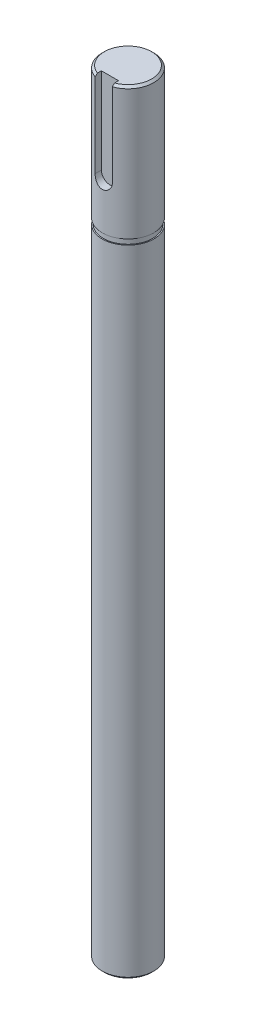
ISO-10303-21;
HEADER;
FILE_DESCRIPTION(('STEP AP214'),'2;1');
FILE_NAME('part.step','',(''),(''),'','','');
FILE_SCHEMA(('AUTOMOTIVE_DESIGN { 1 0 10303 214 1 1 1 1 }'));
ENDSEC;
DATA;
#1=APPLICATION_CONTEXT('core data for automotive mechanical design processes');
#2=APPLICATION_PROTOCOL_DEFINITION('international standard','automotive_design',2000,#1);
#3=PRODUCT_CONTEXT('',#1,'mechanical');
#4=PRODUCT('Part','Part','',(#3));
#5=PRODUCT_RELATED_PRODUCT_CATEGORY('part','',(#4));
#6=PRODUCT_DEFINITION_FORMATION('','',#4);
#7=PRODUCT_DEFINITION_CONTEXT('part definition',#1,'design');
#8=PRODUCT_DEFINITION('design','',#6,#7);
#9=PRODUCT_DEFINITION_SHAPE('','',#8);
#10=(LENGTH_UNIT() NAMED_UNIT(*) SI_UNIT(.MILLI.,.METRE.));
#11=(NAMED_UNIT(*) PLANE_ANGLE_UNIT() SI_UNIT($,.RADIAN.));
#12=(NAMED_UNIT(*) SI_UNIT($,.STERADIAN.) SOLID_ANGLE_UNIT());
#13=UNCERTAINTY_MEASURE_WITH_UNIT(LENGTH_MEASURE(1.E-05),#10,'distance_accuracy_value','');
#14=(GEOMETRIC_REPRESENTATION_CONTEXT(3) GLOBAL_UNCERTAINTY_ASSIGNED_CONTEXT((#13)) GLOBAL_UNIT_ASSIGNED_CONTEXT((#10,
#11,#12)) REPRESENTATION_CONTEXT('',''));
#15=CARTESIAN_POINT('',(0.,0.,0.));
#16=DIRECTION('',(0.,0.,1.));
#17=DIRECTION('',(1.,0.,0.));
#18=AXIS2_PLACEMENT_3D('',#15,#16,#17);
#19=CARTESIAN_POINT('',(0.,180.,0.));
#20=DIRECTION('',(0.,-1.,0.));
#21=DIRECTION('',(0.,0.,-1.));
#22=AXIS2_PLACEMENT_3D('',#19,#20,#21);
#23=CYLINDRICAL_SURFACE('',#22,6.00000000000001);
#24=CARTESIAN_POINT('',(0.,149.25,0.));
#25=DIRECTION('',(0.,-1.,0.));
#26=DIRECTION('',(0.,0.,-1.));
#27=AXIS2_PLACEMENT_3D('',#24,#25,#26);
#28=CIRCLE('',#27,6.00000000000002);
#29=CARTESIAN_POINT('',(0.,149.25,-6.00000000000002));
#30=VERTEX_POINT('',#29);
#31=EDGE_CURVE('E121',#30,#30,#28,.T.);
#32=ORIENTED_EDGE('',*,*,#31,.F.);
#33=EDGE_LOOP('',(#32));
#34=FACE_BOUND('',#33,.T.);
#35=DIRECTION('',(0.,-1.,0.));
#36=VECTOR('',#35,1.);
#37=CARTESIAN_POINT('',(2.,180.,5.65685424949239));
#38=LINE('',#37,#36);
#39=CARTESIAN_POINT('',(2.,179.5,5.65685424949239));
#40=VERTEX_POINT('',#39);
#41=CARTESIAN_POINT('',(2.,160.,5.65685424949239));
#42=VERTEX_POINT('',#41);
#43=EDGE_CURVE('E50',#40,#42,#38,.T.);
#44=ORIENTED_EDGE('',*,*,#43,.T.);
#45=CARTESIAN_POINT('',(2.,160.,5.65685424949239));
#46=CARTESIAN_POINT('',(2.0000014949184,159.945419006398,5.65684884188679));
#47=CARTESIAN_POINT('',(1.99776424917479,159.890865875621,5.65764519886491));
#48=CARTESIAN_POINT('',(1.9888512140728,159.78218283189,5.66078654578443));
#49=CARTESIAN_POINT('',(1.98217662286705,159.728052808681,5.66313111768245));
#50=CARTESIAN_POINT('',(1.95562135046157,159.56721571361,5.67238184449303));
#51=CARTESIAN_POINT('',(1.92920846605622,159.461638307459,5.68150584999031));
#52=CARTESIAN_POINT('',(1.85991682366084,159.256749615112,5.70456149397719));
#53=CARTESIAN_POINT('',(1.81704715197505,159.157434906254,5.7184904790586));
#54=CARTESIAN_POINT('',(1.71614645792972,158.967320331989,5.74957574438923));
#55=CARTESIAN_POINT('',(1.65810612564544,158.876525741865,5.76673400456218));
#56=CARTESIAN_POINT('',(1.526102787046,158.702559537351,5.80308960804097));
#57=CARTESIAN_POINT('',(1.45164996064405,158.619770239075,5.82233755536619));
#58=CARTESIAN_POINT('',(1.28997688598295,158.467587964417,5.86027697385957));
#59=CARTESIAN_POINT('',(1.20275436910905,158.398197373488,5.87896834543707));
#60=CARTESIAN_POINT('',(1.0152072919125,158.273040962392,5.91427765988456));
#61=CARTESIAN_POINT('',(0.914600178716958,158.217678031196,5.93082875123709));
#62=CARTESIAN_POINT('',(0.704858499931678,158.124815496626,5.95939217209318));
#63=CARTESIAN_POINT('',(0.5957265511868,158.087310436359,5.97140588786621));
#64=CARTESIAN_POINT('',(0.376058690956033,158.032528547817,5.98918142285846));
#65=CARTESIAN_POINT('',(0.265703668920183,158.014593454893,5.99514617977148));
#66=CARTESIAN_POINT('',(0.0433979389113074,157.997367402949,6.00087216807635));
#67=CARTESIAN_POINT('',(-0.0685523824908215,157.998072001461,6.00063487762606));
#68=CARTESIAN_POINT('',(-0.286207690558823,158.017688566213,5.99412077270533));
#69=CARTESIAN_POINT('',(-0.391985405251116,158.035885275919,5.98808121982528));
#70=CARTESIAN_POINT('',(-0.598888128753354,158.088786397348,5.97093921001648));
#71=CARTESIAN_POINT('',(-0.700012879232965,158.123491724413,5.95983647235463));
#72=CARTESIAN_POINT('',(-0.896305246061959,158.208842739201,5.93351336542609));
#73=CARTESIAN_POINT('',(-0.991377011308021,158.259692090245,5.91824075676626));
#74=CARTESIAN_POINT('',(-1.17184917819501,158.375719902781,5.88516775360088));
#75=CARTESIAN_POINT('',(-1.2572469394294,158.440902262093,5.86736667195187));
#76=CARTESIAN_POINT('',(-1.42019467942245,158.587342099994,5.83012543885479));
#77=CARTESIAN_POINT('',(-1.49718722322543,158.669211087219,5.81064757359828));
#78=CARTESIAN_POINT('',(-1.6365440496408,158.844882979432,5.77294980945703));
#79=CARTESIAN_POINT('',(-1.69890360636765,158.938689724807,5.75473031831507));
#80=CARTESIAN_POINT('',(-1.80800665118559,159.137360356707,5.72140062752635));
#81=CARTESIAN_POINT('',(-1.85450601901539,159.242367029866,5.70634029896469));
#82=CARTESIAN_POINT('',(-1.92892046140225,159.45929395518,5.68162194124079));
#83=CARTESIAN_POINT('',(-1.95686487211072,159.571202986744,5.67195538817986));
#84=CARTESIAN_POINT('',(-1.98331631256166,159.736837273496,5.66273084189441));
#85=CARTESIAN_POINT('',(-1.98957012251023,159.789282779708,5.66053335389205));
#86=CARTESIAN_POINT('',(-1.99790923214239,159.8944761568,5.65759407142799));
#87=CARTESIAN_POINT('',(-1.99999991078995,159.947223549089,5.65685039859057));
#88=CARTESIAN_POINT('',(-2.,160.,5.65685424949239));
#89=B_SPLINE_CURVE_WITH_KNOTS('',3,(#45,#46,#47,#48,#49,#50,#51,#52,#53,#54,#55,#56,#57,#58,#59,
#60,#61,#62,#63,#64,#65,#66,#67,#68,#69,#70,#71,#72,#73,#74,#75,#76,#77,#78,#79,#80,#81,#82,#83,
#84,#85,#86,#87,#88),.UNSPECIFIED.,.F.,.F.,(4,2,2,2,2,2,2,2,2,2,2,2,2,2,2,2,2,2,2,2,2,4),(0.,
0.163636969470853,0.32722977233892,0.653162396790758,0.9789153219325,1.30486862627064,
1.64233009925355,1.97985159727496,2.32618265866204,2.67240782242257,3.00658941454808,
3.34069136061286,3.66168836931473,3.98270317816497,4.30794037651937,4.63326613177539,
4.97388108116104,5.31460588498488,5.66036059856086,6.00556734973681,6.16399790665496,
6.32222363058107),.UNSPECIFIED.);
#90=CARTESIAN_POINT('',(-2.,160.,5.65685424949239));
#91=VERTEX_POINT('',#90);
#92=EDGE_CURVE('E43',#42,#91,#89,.T.);
#93=ORIENTED_EDGE('',*,*,#92,.T.);
#94=DIRECTION('',(0.,-1.,0.));
#95=VECTOR('',#94,1.);
#96=CARTESIAN_POINT('',(-2.,180.,5.65685424949239));
#97=LINE('',#96,#95);
#98=CARTESIAN_POINT('',(-2.,179.5,5.65685424949239));
#99=VERTEX_POINT('',#98);
#100=EDGE_CURVE('E110',#99,#91,#97,.T.);
#101=ORIENTED_EDGE('',*,*,#100,.F.);
#102=CARTESIAN_POINT('',(0.,179.5,0.));
#103=DIRECTION('',(0.,-1.,0.));
#104=DIRECTION('',(0.,0.,-1.));
#105=AXIS2_PLACEMENT_3D('',#102,#103,#104);
#106=CIRCLE('',#105,6.00000000000001);
#107=EDGE_CURVE('E124',#99,#40,#106,.T.);
#108=ORIENTED_EDGE('',*,*,#107,.T.);
#109=EDGE_LOOP('',(#44,#93,#101,#108));
#110=FACE_BOUND('',#109,.T.);
#111=ADVANCED_FACE('F35',(#34,#110),#23,.T.);
#112=CARTESIAN_POINT('',(0.,179.5,0.));
#113=DIRECTION('',(0.,-1.,0.));
#114=DIRECTION('',(0.,0.,-1.));
#115=AXIS2_PLACEMENT_3D('',#112,#113,#114);
#116=CONICAL_SURFACE('',#115,6.00000000000001,0.78539816339744);
#117=ORIENTED_EDGE('',*,*,#107,.F.);
#118=CARTESIAN_POINT('',(-2.,177.31534168966,7.93653776258945));
#119=CARTESIAN_POINT('',(-2.,177.522505827229,7.72287670549437));
#120=CARTESIAN_POINT('',(-2.,177.729432380004,7.50898412427123));
#121=CARTESIAN_POINT('',(-2.,178.142622212972,7.08055775473074));
#122=CARTESIAN_POINT('',(-2.,178.348885490418,6.86602396376658));
#123=CARTESIAN_POINT('',(-2.,178.760481808926,6.43621933712629));
#124=CARTESIAN_POINT('',(-2.,178.965815169655,6.22094880781992));
#125=CARTESIAN_POINT('',(-2.,179.375341160585,5.78931026757292));
#126=CARTESIAN_POINT('',(-2.,179.579533752166,5.5729422199447));
#127=CARTESIAN_POINT('',(-2.,179.986420638258,5.13861224274198));
#128=CARTESIAN_POINT('',(-2.,180.189114195318,4.92064962161066));
#129=CARTESIAN_POINT('',(-2.,180.592196308459,4.4826272013929));
#130=CARTESIAN_POINT('',(-2.,180.792585050179,4.26256757385628));
#131=CARTESIAN_POINT('',(-2.,181.090574875468,3.93006610720304));
#132=CARTESIAN_POINT('',(-2.,181.189493622389,3.81880606439663));
#133=CARTESIAN_POINT('',(-2.,181.386201186,3.59529657607114));
#134=CARTESIAN_POINT('',(-2.,181.4839900374,3.48304716113229));
#135=CARTESIAN_POINT('',(-2.,181.6781560169,3.25727586479074));
#136=CARTESIAN_POINT('',(-2.,181.774532753493,3.14375364534631));
#137=CARTESIAN_POINT('',(-2.,181.965345705633,2.91507171814836));
#138=CARTESIAN_POINT('',(-2.,182.059781713226,2.79991183712935));
#139=CARTESIAN_POINT('',(-2.,182.152986204319,2.6837476312941));
#140=B_SPLINE_CURVE_WITH_KNOTS('',3,(#118,#119,#120,#121,#122,#123,#124,#125,#126,#127,#128,
#129,#130,#131,#132,#133,#134,#135,#136,#137,#138,#139),.UNSPECIFIED.,.F.,.F.,(4,2,2,2,2,2,2,2,
2,2,4),(0.,0.892812510796145,1.78562871208381,2.67811029704313,3.57062191490155,
4.46354674776352,5.3563991497288,5.80301772358629,6.24962254110716,6.69634892196689,
7.14312292365371),.UNSPECIFIED.);
#141=CARTESIAN_POINT('',(-2.,180.,5.12347538297979));
#142=VERTEX_POINT('',#141);
#143=EDGE_CURVE('E58',#99,#142,#140,.T.);
#144=ORIENTED_EDGE('',*,*,#143,.T.);
#145=CARTESIAN_POINT('',(0.,180.,0.));
#146=DIRECTION('',(0.,-1.,0.));
#147=DIRECTION('',(0.,0.,-1.));
#148=AXIS2_PLACEMENT_3D('',#145,#146,#147);
#149=CIRCLE('',#148,5.49999999999999);
#150=CARTESIAN_POINT('',(2.,180.,5.12347538297979));
#151=VERTEX_POINT('',#150);
#152=EDGE_CURVE('E127',#151,#142,#149,.F.);
#153=ORIENTED_EDGE('',*,*,#152,.F.);
#154=CARTESIAN_POINT('',(2.,177.31534168966,7.93653776258945));
#155=CARTESIAN_POINT('',(2.,177.522505827229,7.72287670549437));
#156=CARTESIAN_POINT('',(2.,177.729432380004,7.50898412427123));
#157=CARTESIAN_POINT('',(2.,178.142622212972,7.08055775473074));
#158=CARTESIAN_POINT('',(2.,178.348885490418,6.86602396376658));
#159=CARTESIAN_POINT('',(2.,178.760481808926,6.43621933712629));
#160=CARTESIAN_POINT('',(2.,178.965815169655,6.22094880781992));
#161=CARTESIAN_POINT('',(2.,179.375341160585,5.78931026757292));
#162=CARTESIAN_POINT('',(2.,179.579533752166,5.5729422199447));
#163=CARTESIAN_POINT('',(2.,179.986420638258,5.13861224274198));
#164=CARTESIAN_POINT('',(2.,180.189114195318,4.92064962161066));
#165=CARTESIAN_POINT('',(2.,180.592196308459,4.4826272013929));
#166=CARTESIAN_POINT('',(2.,180.792585050179,4.26256757385628));
#167=CARTESIAN_POINT('',(2.,181.090574875468,3.93006610720304));
#168=CARTESIAN_POINT('',(2.,181.189493622389,3.81880606439663));
#169=CARTESIAN_POINT('',(2.,181.386201186,3.59529657607114));
#170=CARTESIAN_POINT('',(2.,181.4839900374,3.48304716113229));
#171=CARTESIAN_POINT('',(2.,181.6781560169,3.25727586479074));
#172=CARTESIAN_POINT('',(2.,181.774532753493,3.14375364534631));
#173=CARTESIAN_POINT('',(2.,181.965345705633,2.91507171814836));
#174=CARTESIAN_POINT('',(2.,182.059781713226,2.79991183712935));
#175=CARTESIAN_POINT('',(2.,182.152986204319,2.6837476312941));
#176=B_SPLINE_CURVE_WITH_KNOTS('',3,(#154,#155,#156,#157,#158,#159,#160,#161,#162,#163,#164,
#165,#166,#167,#168,#169,#170,#171,#172,#173,#174,#175),.UNSPECIFIED.,.F.,.F.,(4,2,2,2,2,2,2,2,
2,2,4),(0.,0.892812510796145,1.78562871208381,2.67811029704313,3.57062191490155,
4.46354674776352,5.3563991497288,5.80301772358629,6.24962254110716,6.69634892196689,
7.14312292365371),.UNSPECIFIED.);
#177=EDGE_CURVE('E136',#40,#151,#176,.T.);
#178=ORIENTED_EDGE('',*,*,#177,.F.);
#179=EDGE_LOOP('',(#117,#144,#153,#178));
#180=FACE_BOUND('',#179,.T.);
#181=ADVANCED_FACE('F146',(#180),#116,.T.);
#182=CARTESIAN_POINT('',(0.,0.,0.));
#183=DIRECTION('',(0.,1.,0.));
#184=DIRECTION('',(0.,0.,1.));
#185=AXIS2_PLACEMENT_3D('',#182,#183,#184);
#186=PLANE('',#185);
#187=CARTESIAN_POINT('',(0.,0.,0.));
#188=DIRECTION('',(0.,1.,0.));
#189=DIRECTION('',(0.,0.,1.));
#190=AXIS2_PLACEMENT_3D('',#187,#188,#189);
#191=CIRCLE('',#190,5.49999999999998);
#192=CARTESIAN_POINT('',(0.,0.,5.49999999999998));
#193=VERTEX_POINT('',#192);
#194=EDGE_CURVE('E130',#193,#193,#191,.F.);
#195=ORIENTED_EDGE('',*,*,#194,.T.);
#196=EDGE_LOOP('',(#195));
#197=FACE_BOUND('',#196,.T.);
#198=ADVANCED_FACE('F173',(#197),#186,.F.);
#199=CARTESIAN_POINT('',(0.,180.,0.));
#200=DIRECTION('',(0.,-1.,0.));
#201=DIRECTION('',(0.,0.,-1.));
#202=AXIS2_PLACEMENT_3D('',#199,#200,#201);
#203=PLANE('',#202);
#204=ORIENTED_EDGE('',*,*,#152,.T.);
#205=DIRECTION('',(0.,0.,1.));
#206=VECTOR('',#205,1.);
#207=CARTESIAN_POINT('',(-2.,180.,4.20000000000001));
#208=LINE('',#207,#206);
#209=CARTESIAN_POINT('',(-2.,180.,4.20000000000001));
#210=VERTEX_POINT('',#209);
#211=EDGE_CURVE('E106',#210,#142,#208,.T.);
#212=ORIENTED_EDGE('',*,*,#211,.F.);
#213=DIRECTION('',(-1.,0.,0.));
#214=VECTOR('',#213,1.);
#215=CARTESIAN_POINT('',(0.,180.,4.20000000000001));
#216=LINE('',#215,#214);
#217=CARTESIAN_POINT('',(2.,180.,4.20000000000001));
#218=VERTEX_POINT('',#217);
#219=EDGE_CURVE('E11',#218,#210,#216,.T.);
#220=ORIENTED_EDGE('',*,*,#219,.F.);
#221=DIRECTION('',(0.,0.,1.));
#222=VECTOR('',#221,1.);
#223=CARTESIAN_POINT('',(2.,180.,4.20000000000001));
#224=LINE('',#223,#222);
#225=EDGE_CURVE('E88',#218,#151,#224,.T.);
#226=ORIENTED_EDGE('',*,*,#225,.T.);
#227=EDGE_LOOP('',(#204,#212,#220,#226));
#228=FACE_BOUND('',#227,.T.);
#229=ADVANCED_FACE('F171',(#228),#203,.F.);
#230=CARTESIAN_POINT('',(-6.00000000000002,149.25,0.));
#231=DIRECTION('',(0.,1.,0.));
#232=DIRECTION('',(0.,0.,1.));
#233=AXIS2_PLACEMENT_3D('',#230,#231,#232);
#234=PLANE('',#233);
#235=CARTESIAN_POINT('',(0.,149.25,0.));
#236=DIRECTION('',(0.,-1.,0.));
#237=DIRECTION('',(0.,0.,-1.));
#238=AXIS2_PLACEMENT_3D('',#235,#236,#237);
#239=CIRCLE('',#238,5.75);
#240=CARTESIAN_POINT('',(0.,149.25,-5.75));
#241=VERTEX_POINT('',#240);
#242=EDGE_CURVE('E118',#241,#241,#239,.T.);
#243=ORIENTED_EDGE('',*,*,#242,.F.);
#244=EDGE_LOOP('',(#243));
#245=FACE_BOUND('',#244,.T.);
#246=ORIENTED_EDGE('',*,*,#31,.T.);
#247=EDGE_LOOP('',(#246));
#248=FACE_BOUND('',#247,.T.);
#249=ADVANCED_FACE('F169',(#245,#248),#234,.F.);
#250=CARTESIAN_POINT('',(0.,180.,0.));
#251=DIRECTION('',(0.,-1.,0.));
#252=DIRECTION('',(0.,0.,-1.));
#253=AXIS2_PLACEMENT_3D('',#250,#251,#252);
#254=CYLINDRICAL_SURFACE('',#253,5.75);
#255=CARTESIAN_POINT('',(0.,148.,0.));
#256=DIRECTION('',(0.,-1.,0.));
#257=DIRECTION('',(0.,0.,-1.));
#258=AXIS2_PLACEMENT_3D('',#255,#256,#257);
#259=CIRCLE('',#258,5.75);
#260=CARTESIAN_POINT('',(0.,148.,-5.75));
#261=VERTEX_POINT('',#260);
#262=EDGE_CURVE('E115',#261,#261,#259,.T.);
#263=ORIENTED_EDGE('',*,*,#262,.F.);
#264=EDGE_LOOP('',(#263));
#265=FACE_BOUND('',#264,.T.);
#266=ORIENTED_EDGE('',*,*,#242,.T.);
#267=EDGE_LOOP('',(#266));
#268=FACE_BOUND('',#267,.T.);
#269=ADVANCED_FACE('F197',(#265,#268),#254,.T.);
#270=CARTESIAN_POINT('',(-6.00000000000002,148.,0.));
#271=DIRECTION('',(0.,-1.,0.));
#272=DIRECTION('',(0.,0.,-1.));
#273=AXIS2_PLACEMENT_3D('',#270,#271,#272);
#274=PLANE('',#273);
#275=CARTESIAN_POINT('',(0.,148.,0.));
#276=DIRECTION('',(0.,-1.,0.));
#277=DIRECTION('',(0.,0.,-1.));
#278=AXIS2_PLACEMENT_3D('',#275,#276,#277);
#279=CIRCLE('',#278,6.00000000000002);
#280=CARTESIAN_POINT('',(0.,148.,-6.00000000000002));
#281=VERTEX_POINT('',#280);
#282=EDGE_CURVE('E112',#281,#281,#279,.T.);
#283=ORIENTED_EDGE('',*,*,#282,.F.);
#284=EDGE_LOOP('',(#283));
#285=FACE_BOUND('',#284,.T.);
#286=ORIENTED_EDGE('',*,*,#262,.T.);
#287=EDGE_LOOP('',(#286));
#288=FACE_BOUND('',#287,.T.);
#289=ADVANCED_FACE('F189',(#285,#288),#274,.F.);
#290=CARTESIAN_POINT('',(0.,180.,0.));
#291=DIRECTION('',(0.,-1.,0.));
#292=DIRECTION('',(0.,0.,-1.));
#293=AXIS2_PLACEMENT_3D('',#290,#291,#292);
#294=CYLINDRICAL_SURFACE('',#293,6.00000000000001);
#295=CARTESIAN_POINT('',(0.,0.5,0.));
#296=DIRECTION('',(0.,1.,0.));
#297=DIRECTION('',(0.,0.,1.));
#298=AXIS2_PLACEMENT_3D('',#295,#296,#297);
#299=CIRCLE('',#298,6.00000000000001);
#300=CARTESIAN_POINT('',(0.,0.5,6.00000000000001));
#301=VERTEX_POINT('',#300);
#302=EDGE_CURVE('E133',#301,#301,#299,.T.);
#303=ORIENTED_EDGE('',*,*,#302,.T.);
#304=EDGE_LOOP('',(#303));
#305=FACE_BOUND('',#304,.T.);
#306=ORIENTED_EDGE('',*,*,#282,.T.);
#307=EDGE_LOOP('',(#306));
#308=FACE_BOUND('',#307,.T.);
#309=ADVANCED_FACE('F158',(#305,#308),#294,.T.);
#310=CARTESIAN_POINT('',(0.,0.,0.));
#311=DIRECTION('',(0.,1.,0.));
#312=DIRECTION('',(0.,0.,1.));
#313=AXIS2_PLACEMENT_3D('',#310,#311,#312);
#314=CONICAL_SURFACE('',#313,5.49999999999998,0.785398163397481);
#315=ORIENTED_EDGE('',*,*,#302,.F.);
#316=EDGE_LOOP('',(#315));
#317=FACE_BOUND('',#316,.T.);
#318=ORIENTED_EDGE('',*,*,#194,.F.);
#319=EDGE_LOOP('',(#318));
#320=FACE_BOUND('',#319,.T.);
#321=ADVANCED_FACE('F37',(#317,#320),#314,.T.);
#322=CARTESIAN_POINT('',(0.,160.,4.20000000000001));
#323=DIRECTION('',(0.,0.,1.));
#324=DIRECTION('',(1.,0.,0.));
#325=AXIS2_PLACEMENT_3D('',#322,#323,#324);
#326=PLANE('',#325);
#327=ORIENTED_EDGE('',*,*,#219,.T.);
#328=DIRECTION('',(0.,1.,0.));
#329=VECTOR('',#328,1.);
#330=CARTESIAN_POINT('',(-2.,160.,4.20000000000001));
#331=LINE('',#330,#329);
#332=CARTESIAN_POINT('',(-2.,160.,4.20000000000001));
#333=VERTEX_POINT('',#332);
#334=EDGE_CURVE('E89',#333,#210,#331,.T.);
#335=ORIENTED_EDGE('',*,*,#334,.F.);
#336=CARTESIAN_POINT('',(0.,160.,4.20000000000001));
#337=DIRECTION('',(0.,0.,1.));
#338=DIRECTION('',(1.,0.,0.));
#339=AXIS2_PLACEMENT_3D('',#336,#337,#338);
#340=CIRCLE('',#339,2.);
#341=CARTESIAN_POINT('',(2.,160.,4.20000000000001));
#342=VERTEX_POINT('',#341);
#343=EDGE_CURVE('E86',#333,#342,#340,.T.);
#344=ORIENTED_EDGE('',*,*,#343,.T.);
#345=DIRECTION('',(0.,1.,0.));
#346=VECTOR('',#345,1.);
#347=CARTESIAN_POINT('',(2.,160.,4.20000000000001));
#348=LINE('',#347,#346);
#349=EDGE_CURVE('E92',#342,#218,#348,.T.);
#350=ORIENTED_EDGE('',*,*,#349,.T.);
#351=EDGE_LOOP('',(#327,#335,#344,#350));
#352=FACE_BOUND('',#351,.T.);
#353=ADVANCED_FACE('F99',(#352),#326,.T.);
#354=CARTESIAN_POINT('',(0.,160.,4.20000000000001));
#355=DIRECTION('',(0.,0.,1.));
#356=DIRECTION('',(1.,0.,0.));
#357=AXIS2_PLACEMENT_3D('',#354,#355,#356);
#358=CYLINDRICAL_SURFACE('',#357,2.);
#359=DIRECTION('',(0.,0.,1.));
#360=VECTOR('',#359,1.);
#361=CARTESIAN_POINT('',(2.,160.,4.20000000000001));
#362=LINE('',#361,#360);
#363=EDGE_CURVE('E81',#342,#42,#362,.T.);
#364=ORIENTED_EDGE('',*,*,#363,.F.);
#365=ORIENTED_EDGE('',*,*,#343,.F.);
#366=DIRECTION('',(0.,0.,1.));
#367=VECTOR('',#366,1.);
#368=CARTESIAN_POINT('',(-2.,160.,4.20000000000001));
#369=LINE('',#368,#367);
#370=EDGE_CURVE('E104',#333,#91,#369,.T.);
#371=ORIENTED_EDGE('',*,*,#370,.T.);
#372=ORIENTED_EDGE('',*,*,#92,.F.);
#373=EDGE_LOOP('',(#364,#365,#371,#372));
#374=FACE_BOUND('',#373,.T.);
#375=ADVANCED_FACE('F83',(#374),#358,.F.);
#376=CARTESIAN_POINT('',(-2.,160.,4.20000000000001));
#377=DIRECTION('',(1.,0.,0.));
#378=DIRECTION('',(0.,0.,-1.));
#379=AXIS2_PLACEMENT_3D('',#376,#377,#378);
#380=PLANE('',#379);
#381=ORIENTED_EDGE('',*,*,#100,.T.);
#382=ORIENTED_EDGE('',*,*,#370,.F.);
#383=ORIENTED_EDGE('',*,*,#334,.T.);
#384=ORIENTED_EDGE('',*,*,#211,.T.);
#385=ORIENTED_EDGE('',*,*,#143,.F.);
#386=EDGE_LOOP('',(#381,#382,#383,#384,#385));
#387=FACE_BOUND('',#386,.T.);
#388=ADVANCED_FACE('F152',(#387),#380,.T.);
#389=CARTESIAN_POINT('',(2.,160.,4.20000000000001));
#390=DIRECTION('',(1.,0.,0.));
#391=DIRECTION('',(0.,0.,-1.));
#392=AXIS2_PLACEMENT_3D('',#389,#390,#391);
#393=PLANE('',#392);
#394=ORIENTED_EDGE('',*,*,#177,.T.);
#395=ORIENTED_EDGE('',*,*,#225,.F.);
#396=ORIENTED_EDGE('',*,*,#349,.F.);
#397=ORIENTED_EDGE('',*,*,#363,.T.);
#398=ORIENTED_EDGE('',*,*,#43,.F.);
#399=EDGE_LOOP('',(#394,#395,#396,#397,#398));
#400=FACE_BOUND('',#399,.T.);
#401=ADVANCED_FACE('F93',(#400),#393,.F.);
#402=CLOSED_SHELL('',(#111,#181,#198,#229,#249,#269,#289,#309,#321,#353,#375,#388,#401));
#403=MANIFOLD_SOLID_BREP('B2',#402);
#404=ADVANCED_BREP_SHAPE_REPRESENTATION('',(#18,#403),#14);
#405=SHAPE_DEFINITION_REPRESENTATION(#9,#404);
ENDSEC;
END-ISO-10303-21;
